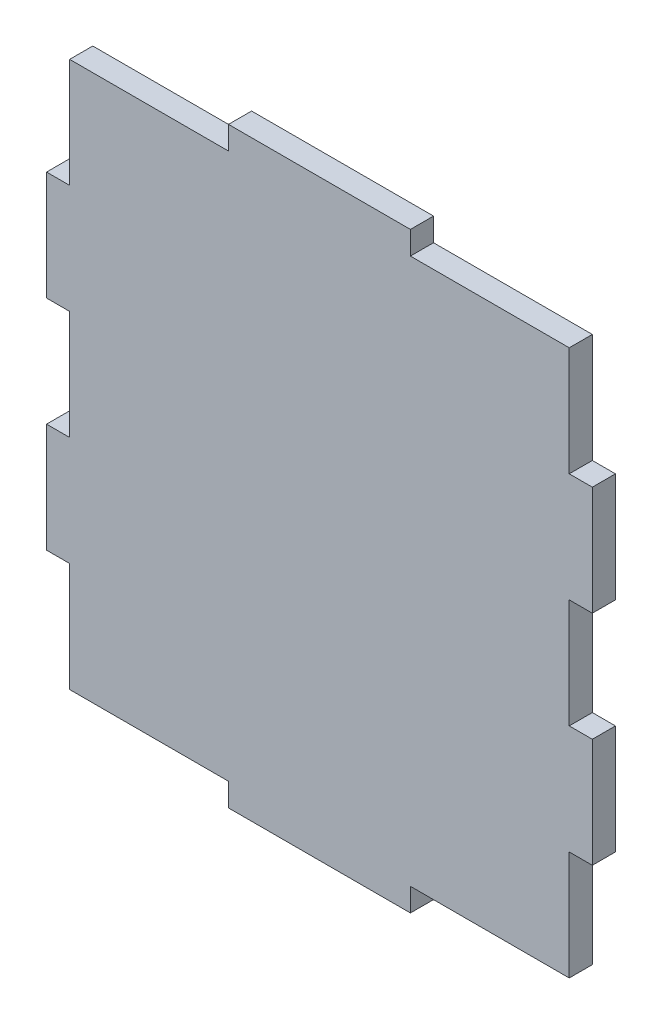
ISO-10303-21;
HEADER;
FILE_DESCRIPTION(('STEP AP214'),'2;1');
FILE_NAME('part.step','',(''),(''),'','','');
FILE_SCHEMA(('AUTOMOTIVE_DESIGN { 1 0 10303 214 1 1 1 1 }'));
ENDSEC;
DATA;
#1=APPLICATION_CONTEXT('core data for automotive mechanical design processes');
#2=APPLICATION_PROTOCOL_DEFINITION('international standard','automotive_design',2000,#1);
#3=PRODUCT_CONTEXT('',#1,'mechanical');
#4=PRODUCT('Part','Part','',(#3));
#5=PRODUCT_RELATED_PRODUCT_CATEGORY('part','',(#4));
#6=PRODUCT_DEFINITION_FORMATION('','',#4);
#7=PRODUCT_DEFINITION_CONTEXT('part definition',#1,'design');
#8=PRODUCT_DEFINITION('design','',#6,#7);
#9=PRODUCT_DEFINITION_SHAPE('','',#8);
#10=(LENGTH_UNIT() NAMED_UNIT(*) SI_UNIT(.MILLI.,.METRE.));
#11=(NAMED_UNIT(*) PLANE_ANGLE_UNIT() SI_UNIT($,.RADIAN.));
#12=(NAMED_UNIT(*) SI_UNIT($,.STERADIAN.) SOLID_ANGLE_UNIT());
#13=UNCERTAINTY_MEASURE_WITH_UNIT(LENGTH_MEASURE(1.E-05),#10,'distance_accuracy_value','');
#14=(GEOMETRIC_REPRESENTATION_CONTEXT(3) GLOBAL_UNCERTAINTY_ASSIGNED_CONTEXT((#13)) GLOBAL_UNIT_ASSIGNED_CONTEXT((#10,
#11,#12)) REPRESENTATION_CONTEXT('',''));
#15=CARTESIAN_POINT('',(0.,0.,0.));
#16=DIRECTION('',(0.,0.,1.));
#17=DIRECTION('',(1.,0.,0.));
#18=AXIS2_PLACEMENT_3D('',#15,#16,#17);
#19=CARTESIAN_POINT('',(-38.3669811320755,56.8820780577358,6.35));
#20=DIRECTION('',(1.,0.,0.));
#21=DIRECTION('',(0.,0.,-1.));
#22=AXIS2_PLACEMENT_3D('',#19,#20,#21);
#23=PLANE('',#22);
#24=DIRECTION('',(0.,-1.,0.));
#25=VECTOR('',#24,1.);
#26=CARTESIAN_POINT('',(-38.3669811320755,56.8820780577358,0.));
#27=LINE('',#26,#25);
#28=CARTESIAN_POINT('',(-38.3669811320755,56.8820780577358,0.));
#29=VERTEX_POINT('',#28);
#30=CARTESIAN_POINT('',(-38.3669811320755,26.8820780577358,0.));
#31=VERTEX_POINT('',#30);
#32=EDGE_CURVE('E249',#29,#31,#27,.T.);
#33=ORIENTED_EDGE('',*,*,#32,.T.);
#34=DIRECTION('',(0.,0.,-1.));
#35=VECTOR('',#34,1.);
#36=CARTESIAN_POINT('',(-38.3669811320755,26.8820780577358,6.35));
#37=LINE('',#36,#35);
#38=CARTESIAN_POINT('',(-38.3669811320755,26.8820780577358,6.35));
#39=VERTEX_POINT('',#38);
#40=EDGE_CURVE('E11',#39,#31,#37,.T.);
#41=ORIENTED_EDGE('',*,*,#40,.F.);
#42=DIRECTION('',(0.,-1.,0.));
#43=VECTOR('',#42,1.);
#44=CARTESIAN_POINT('',(-38.3669811320755,56.8820780577358,6.35));
#45=LINE('',#44,#43);
#46=CARTESIAN_POINT('',(-38.3669811320755,56.8820780577358,6.35));
#47=VERTEX_POINT('',#46);
#48=EDGE_CURVE('E303',#47,#39,#45,.T.);
#49=ORIENTED_EDGE('',*,*,#48,.F.);
#50=DIRECTION('',(0.,0.,-1.));
#51=VECTOR('',#50,1.);
#52=CARTESIAN_POINT('',(-38.3669811320755,56.8820780577358,6.35));
#53=LINE('',#52,#51);
#54=EDGE_CURVE('E245',#47,#29,#53,.T.);
#55=ORIENTED_EDGE('',*,*,#54,.T.);
#56=EDGE_LOOP('',(#33,#41,#49,#55));
#57=FACE_BOUND('',#56,.T.);
#58=ADVANCED_FACE('F33',(#57),#23,.F.);
#59=CARTESIAN_POINT('',(-38.3669811320755,26.8820780577358,6.35));
#60=DIRECTION('',(0.,-1.,0.));
#61=DIRECTION('',(0.,0.,-1.));
#62=AXIS2_PLACEMENT_3D('',#59,#60,#61);
#63=PLANE('',#62);
#64=DIRECTION('',(-1.,0.,0.));
#65=VECTOR('',#64,1.);
#66=CARTESIAN_POINT('',(-38.3669811320755,26.8820780577358,0.));
#67=LINE('',#66,#65);
#68=CARTESIAN_POINT('',(-44.7169811320755,26.8820780577358,0.));
#69=VERTEX_POINT('',#68);
#70=EDGE_CURVE('E252',#31,#69,#67,.T.);
#71=ORIENTED_EDGE('',*,*,#70,.T.);
#72=DIRECTION('',(0.,0.,-1.));
#73=VECTOR('',#72,1.);
#74=CARTESIAN_POINT('',(-44.7169811320755,26.8820780577358,6.35));
#75=LINE('',#74,#73);
#76=CARTESIAN_POINT('',(-44.7169811320755,26.8820780577358,6.35));
#77=VERTEX_POINT('',#76);
#78=EDGE_CURVE('E41',#77,#69,#75,.T.);
#79=ORIENTED_EDGE('',*,*,#78,.F.);
#80=DIRECTION('',(-1.,0.,0.));
#81=VECTOR('',#80,1.);
#82=CARTESIAN_POINT('',(-38.3669811320755,26.8820780577358,6.35));
#83=LINE('',#82,#81);
#84=EDGE_CURVE('E152',#39,#77,#83,.T.);
#85=ORIENTED_EDGE('',*,*,#84,.F.);
#86=ORIENTED_EDGE('',*,*,#40,.T.);
#87=EDGE_LOOP('',(#71,#79,#85,#86));
#88=FACE_BOUND('',#87,.T.);
#89=ADVANCED_FACE('F461',(#88),#63,.F.);
#90=CARTESIAN_POINT('',(-44.7169811320755,26.8820780577358,6.35));
#91=DIRECTION('',(1.,0.,0.));
#92=DIRECTION('',(0.,1.,0.));
#93=AXIS2_PLACEMENT_3D('',#90,#91,#92);
#94=PLANE('',#93);
#95=DIRECTION('',(0.,-1.,0.));
#96=VECTOR('',#95,1.);
#97=CARTESIAN_POINT('',(-44.7169811320755,26.8820780577358,0.));
#98=LINE('',#97,#96);
#99=CARTESIAN_POINT('',(-44.7169811320755,-3.11792194226419,0.));
#100=VERTEX_POINT('',#99);
#101=EDGE_CURVE('E254',#69,#100,#98,.T.);
#102=ORIENTED_EDGE('',*,*,#101,.T.);
#103=DIRECTION('',(0.,0.,-1.));
#104=VECTOR('',#103,1.);
#105=CARTESIAN_POINT('',(-44.7169811320755,-3.11792194226419,6.35));
#106=LINE('',#105,#104);
#107=CARTESIAN_POINT('',(-44.7169811320755,-3.11792194226419,6.35));
#108=VERTEX_POINT('',#107);
#109=EDGE_CURVE('E370',#108,#100,#106,.T.);
#110=ORIENTED_EDGE('',*,*,#109,.F.);
#111=DIRECTION('',(0.,-1.,0.));
#112=VECTOR('',#111,1.);
#113=CARTESIAN_POINT('',(-44.7169811320755,26.8820780577358,6.35));
#114=LINE('',#113,#112);
#115=EDGE_CURVE('E378',#77,#108,#114,.T.);
#116=ORIENTED_EDGE('',*,*,#115,.F.);
#117=ORIENTED_EDGE('',*,*,#78,.T.);
#118=EDGE_LOOP('',(#102,#110,#116,#117));
#119=FACE_BOUND('',#118,.T.);
#120=ADVANCED_FACE('F376',(#119),#94,.F.);
#121=CARTESIAN_POINT('',(-44.7169811320755,-3.11792194226419,6.35));
#122=DIRECTION('',(0.,1.,0.));
#123=DIRECTION('',(0.,0.,1.));
#124=AXIS2_PLACEMENT_3D('',#121,#122,#123);
#125=PLANE('',#124);
#126=DIRECTION('',(1.,0.,0.));
#127=VECTOR('',#126,1.);
#128=CARTESIAN_POINT('',(-44.7169811320755,-3.11792194226419,0.));
#129=LINE('',#128,#127);
#130=CARTESIAN_POINT('',(-38.3669811320755,-3.11792194226419,0.));
#131=VERTEX_POINT('',#130);
#132=EDGE_CURVE('E256',#100,#131,#129,.T.);
#133=ORIENTED_EDGE('',*,*,#132,.T.);
#134=DIRECTION('',(0.,0.,-1.));
#135=VECTOR('',#134,1.);
#136=CARTESIAN_POINT('',(-38.3669811320755,-3.11792194226419,6.35));
#137=LINE('',#136,#135);
#138=CARTESIAN_POINT('',(-38.3669811320755,-3.11792194226419,6.35));
#139=VERTEX_POINT('',#138);
#140=EDGE_CURVE('E367',#139,#131,#137,.T.);
#141=ORIENTED_EDGE('',*,*,#140,.F.);
#142=DIRECTION('',(1.,0.,0.));
#143=VECTOR('',#142,1.);
#144=CARTESIAN_POINT('',(-44.7169811320755,-3.11792194226419,6.35));
#145=LINE('',#144,#143);
#146=EDGE_CURVE('E396',#108,#139,#145,.T.);
#147=ORIENTED_EDGE('',*,*,#146,.F.);
#148=ORIENTED_EDGE('',*,*,#109,.T.);
#149=EDGE_LOOP('',(#133,#141,#147,#148));
#150=FACE_BOUND('',#149,.T.);
#151=ADVANCED_FACE('F387',(#150),#125,.F.);
#152=CARTESIAN_POINT('',(-38.3669811320755,-3.11792194226419,6.35));
#153=DIRECTION('',(1.,0.,0.));
#154=DIRECTION('',(0.,1.,0.));
#155=AXIS2_PLACEMENT_3D('',#152,#153,#154);
#156=PLANE('',#155);
#157=DIRECTION('',(0.,-1.,0.));
#158=VECTOR('',#157,1.);
#159=CARTESIAN_POINT('',(-38.3669811320755,-3.11792194226419,0.));
#160=LINE('',#159,#158);
#161=CARTESIAN_POINT('',(-38.3669811320755,-33.1179219422642,0.));
#162=VERTEX_POINT('',#161);
#163=EDGE_CURVE('E258',#131,#162,#160,.T.);
#164=ORIENTED_EDGE('',*,*,#163,.T.);
#165=DIRECTION('',(0.,0.,-1.));
#166=VECTOR('',#165,1.);
#167=CARTESIAN_POINT('',(-38.3669811320755,-33.1179219422642,6.35));
#168=LINE('',#167,#166);
#169=CARTESIAN_POINT('',(-38.3669811320755,-33.1179219422642,6.35));
#170=VERTEX_POINT('',#169);
#171=EDGE_CURVE('E364',#170,#162,#168,.T.);
#172=ORIENTED_EDGE('',*,*,#171,.F.);
#173=DIRECTION('',(0.,-1.,0.));
#174=VECTOR('',#173,1.);
#175=CARTESIAN_POINT('',(-38.3669811320755,-3.11792194226419,6.35));
#176=LINE('',#175,#174);
#177=EDGE_CURVE('E393',#139,#170,#176,.T.);
#178=ORIENTED_EDGE('',*,*,#177,.F.);
#179=ORIENTED_EDGE('',*,*,#140,.T.);
#180=EDGE_LOOP('',(#164,#172,#178,#179));
#181=FACE_BOUND('',#180,.T.);
#182=ADVANCED_FACE('F391',(#181),#156,.F.);
#183=CARTESIAN_POINT('',(-38.3669811320755,-33.1179219422642,6.35));
#184=DIRECTION('',(0.,-1.,0.));
#185=DIRECTION('',(1.,0.,0.));
#186=AXIS2_PLACEMENT_3D('',#183,#184,#185);
#187=PLANE('',#186);
#188=DIRECTION('',(-1.,0.,0.));
#189=VECTOR('',#188,1.);
#190=CARTESIAN_POINT('',(-38.3669811320755,-33.1179219422642,0.));
#191=LINE('',#190,#189);
#192=CARTESIAN_POINT('',(-44.7169811320755,-33.1179219422642,0.));
#193=VERTEX_POINT('',#192);
#194=EDGE_CURVE('E260',#162,#193,#191,.T.);
#195=ORIENTED_EDGE('',*,*,#194,.T.);
#196=DIRECTION('',(0.,0.,-1.));
#197=VECTOR('',#196,1.);
#198=CARTESIAN_POINT('',(-44.7169811320755,-33.1179219422642,6.35));
#199=LINE('',#198,#197);
#200=CARTESIAN_POINT('',(-44.7169811320755,-33.1179219422642,6.35));
#201=VERTEX_POINT('',#200);
#202=EDGE_CURVE('E361',#201,#193,#199,.T.);
#203=ORIENTED_EDGE('',*,*,#202,.F.);
#204=DIRECTION('',(-1.,0.,0.));
#205=VECTOR('',#204,1.);
#206=CARTESIAN_POINT('',(-38.3669811320755,-33.1179219422642,6.35));
#207=LINE('',#206,#205);
#208=EDGE_CURVE('E395',#170,#201,#207,.T.);
#209=ORIENTED_EDGE('',*,*,#208,.F.);
#210=ORIENTED_EDGE('',*,*,#171,.T.);
#211=EDGE_LOOP('',(#195,#203,#209,#210));
#212=FACE_BOUND('',#211,.T.);
#213=ADVANCED_FACE('F474',(#212),#187,.F.);
#214=CARTESIAN_POINT('',(-44.7169811320755,-33.1179219422642,6.35));
#215=DIRECTION('',(1.,0.,0.));
#216=DIRECTION('',(0.,1.,0.));
#217=AXIS2_PLACEMENT_3D('',#214,#215,#216);
#218=PLANE('',#217);
#219=DIRECTION('',(0.,-1.,0.));
#220=VECTOR('',#219,1.);
#221=CARTESIAN_POINT('',(-44.7169811320755,-33.1179219422642,0.));
#222=LINE('',#221,#220);
#223=CARTESIAN_POINT('',(-44.7169811320754,-63.1179219422642,0.));
#224=VERTEX_POINT('',#223);
#225=EDGE_CURVE('E262',#193,#224,#222,.T.);
#226=ORIENTED_EDGE('',*,*,#225,.T.);
#227=DIRECTION('',(0.,0.,-1.));
#228=VECTOR('',#227,1.);
#229=CARTESIAN_POINT('',(-44.7169811320754,-63.1179219422642,6.35));
#230=LINE('',#229,#228);
#231=CARTESIAN_POINT('',(-44.7169811320754,-63.1179219422642,6.35));
#232=VERTEX_POINT('',#231);
#233=EDGE_CURVE('E358',#232,#224,#230,.T.);
#234=ORIENTED_EDGE('',*,*,#233,.F.);
#235=DIRECTION('',(0.,-1.,0.));
#236=VECTOR('',#235,1.);
#237=CARTESIAN_POINT('',(-44.7169811320755,-33.1179219422642,6.35));
#238=LINE('',#237,#236);
#239=EDGE_CURVE('E398',#201,#232,#238,.T.);
#240=ORIENTED_EDGE('',*,*,#239,.F.);
#241=ORIENTED_EDGE('',*,*,#202,.T.);
#242=EDGE_LOOP('',(#226,#234,#240,#241));
#243=FACE_BOUND('',#242,.T.);
#244=ADVANCED_FACE('F477',(#243),#218,.F.);
#245=CARTESIAN_POINT('',(-44.7169811320754,-63.1179219422642,6.35));
#246=DIRECTION('',(0.,1.,0.));
#247=DIRECTION('',(0.,0.,1.));
#248=AXIS2_PLACEMENT_3D('',#245,#246,#247);
#249=PLANE('',#248);
#250=DIRECTION('',(1.,0.,0.));
#251=VECTOR('',#250,1.);
#252=CARTESIAN_POINT('',(-44.7169811320754,-63.1179219422642,0.));
#253=LINE('',#252,#251);
#254=CARTESIAN_POINT('',(-38.3669811320754,-63.1179219422642,0.));
#255=VERTEX_POINT('',#254);
#256=EDGE_CURVE('E264',#224,#255,#253,.T.);
#257=ORIENTED_EDGE('',*,*,#256,.T.);
#258=DIRECTION('',(0.,0.,-1.));
#259=VECTOR('',#258,1.);
#260=CARTESIAN_POINT('',(-38.3669811320754,-63.1179219422642,6.35));
#261=LINE('',#260,#259);
#262=CARTESIAN_POINT('',(-38.3669811320754,-63.1179219422642,6.35));
#263=VERTEX_POINT('',#262);
#264=EDGE_CURVE('E355',#263,#255,#261,.T.);
#265=ORIENTED_EDGE('',*,*,#264,.F.);
#266=DIRECTION('',(1.,0.,0.));
#267=VECTOR('',#266,1.);
#268=CARTESIAN_POINT('',(-44.7169811320754,-63.1179219422642,6.35));
#269=LINE('',#268,#267);
#270=EDGE_CURVE('E404',#232,#263,#269,.T.);
#271=ORIENTED_EDGE('',*,*,#270,.F.);
#272=ORIENTED_EDGE('',*,*,#233,.T.);
#273=EDGE_LOOP('',(#257,#265,#271,#272));
#274=FACE_BOUND('',#273,.T.);
#275=ADVANCED_FACE('F481',(#274),#249,.F.);
#276=CARTESIAN_POINT('',(-38.3669811320754,-63.1179219422642,6.35));
#277=DIRECTION('',(1.,0.,0.));
#278=DIRECTION('',(0.,0.,-1.));
#279=AXIS2_PLACEMENT_3D('',#276,#277,#278);
#280=PLANE('',#279);
#281=DIRECTION('',(0.,-1.,0.));
#282=VECTOR('',#281,1.);
#283=CARTESIAN_POINT('',(-38.3669811320754,-63.1179219422642,0.));
#284=LINE('',#283,#282);
#285=CARTESIAN_POINT('',(-38.3669811320754,-93.1179219422641,0.));
#286=VERTEX_POINT('',#285);
#287=EDGE_CURVE('E266',#255,#286,#284,.T.);
#288=ORIENTED_EDGE('',*,*,#287,.T.);
#289=DIRECTION('',(0.,0.,-1.));
#290=VECTOR('',#289,1.);
#291=CARTESIAN_POINT('',(-38.3669811320754,-93.1179219422641,6.35));
#292=LINE('',#291,#290);
#293=CARTESIAN_POINT('',(-38.3669811320754,-93.1179219422641,6.35));
#294=VERTEX_POINT('',#293);
#295=EDGE_CURVE('E352',#294,#286,#292,.T.);
#296=ORIENTED_EDGE('',*,*,#295,.F.);
#297=DIRECTION('',(0.,-1.,0.));
#298=VECTOR('',#297,1.);
#299=CARTESIAN_POINT('',(-38.3669811320754,-63.1179219422642,6.35));
#300=LINE('',#299,#298);
#301=EDGE_CURVE('E406',#263,#294,#300,.T.);
#302=ORIENTED_EDGE('',*,*,#301,.F.);
#303=ORIENTED_EDGE('',*,*,#264,.T.);
#304=EDGE_LOOP('',(#288,#296,#302,#303));
#305=FACE_BOUND('',#304,.T.);
#306=ADVANCED_FACE('F485',(#305),#280,.F.);
#307=CARTESIAN_POINT('',(-38.3669811320754,-93.1179219422641,6.35));
#308=DIRECTION('',(0.,1.,0.));
#309=DIRECTION('',(0.,0.,1.));
#310=AXIS2_PLACEMENT_3D('',#307,#308,#309);
#311=PLANE('',#310);
#312=DIRECTION('',(1.,0.,0.));
#313=VECTOR('',#312,1.);
#314=CARTESIAN_POINT('',(-38.3669811320754,-93.1179219422641,0.));
#315=LINE('',#314,#313);
#316=CARTESIAN_POINT('',(5.28301886792427,-93.1179219422641,0.));
#317=VERTEX_POINT('',#316);
#318=EDGE_CURVE('E268',#286,#317,#315,.T.);
#319=ORIENTED_EDGE('',*,*,#318,.T.);
#320=DIRECTION('',(0.,0.,-1.));
#321=VECTOR('',#320,1.);
#322=CARTESIAN_POINT('',(5.28301886792427,-93.1179219422641,6.35));
#323=LINE('',#322,#321);
#324=CARTESIAN_POINT('',(5.28301886792427,-93.1179219422641,6.35));
#325=VERTEX_POINT('',#324);
#326=EDGE_CURVE('E349',#325,#317,#323,.T.);
#327=ORIENTED_EDGE('',*,*,#326,.F.);
#328=DIRECTION('',(1.,0.,0.));
#329=VECTOR('',#328,1.);
#330=CARTESIAN_POINT('',(-38.3669811320754,-93.1179219422641,6.35));
#331=LINE('',#330,#329);
#332=EDGE_CURVE('E408',#294,#325,#331,.T.);
#333=ORIENTED_EDGE('',*,*,#332,.F.);
#334=ORIENTED_EDGE('',*,*,#295,.T.);
#335=EDGE_LOOP('',(#319,#327,#333,#334));
#336=FACE_BOUND('',#335,.T.);
#337=ADVANCED_FACE('F489',(#336),#311,.F.);
#338=CARTESIAN_POINT('',(5.28301886792427,-93.1179219422641,6.35));
#339=DIRECTION('',(1.,0.,0.));
#340=DIRECTION('',(0.,1.,0.));
#341=AXIS2_PLACEMENT_3D('',#338,#339,#340);
#342=PLANE('',#341);
#343=DIRECTION('',(0.,-1.,0.));
#344=VECTOR('',#343,1.);
#345=CARTESIAN_POINT('',(5.28301886792427,-93.1179219422641,0.));
#346=LINE('',#345,#344);
#347=CARTESIAN_POINT('',(5.28301886792427,-99.4679219422641,0.));
#348=VERTEX_POINT('',#347);
#349=EDGE_CURVE('E270',#317,#348,#346,.T.);
#350=ORIENTED_EDGE('',*,*,#349,.T.);
#351=DIRECTION('',(0.,0.,-1.));
#352=VECTOR('',#351,1.);
#353=CARTESIAN_POINT('',(5.28301886792427,-99.4679219422641,6.35));
#354=LINE('',#353,#352);
#355=CARTESIAN_POINT('',(5.28301886792427,-99.4679219422641,6.35));
#356=VERTEX_POINT('',#355);
#357=EDGE_CURVE('E346',#356,#348,#354,.T.);
#358=ORIENTED_EDGE('',*,*,#357,.F.);
#359=DIRECTION('',(0.,-1.,0.));
#360=VECTOR('',#359,1.);
#361=CARTESIAN_POINT('',(5.28301886792427,-93.1179219422641,6.35));
#362=LINE('',#361,#360);
#363=EDGE_CURVE('E410',#325,#356,#362,.T.);
#364=ORIENTED_EDGE('',*,*,#363,.F.);
#365=ORIENTED_EDGE('',*,*,#326,.T.);
#366=EDGE_LOOP('',(#350,#358,#364,#365));
#367=FACE_BOUND('',#366,.T.);
#368=ADVANCED_FACE('F493',(#367),#342,.F.);
#369=CARTESIAN_POINT('',(5.28301886792427,-99.4679219422641,6.35));
#370=DIRECTION('',(0.,1.,0.));
#371=DIRECTION('',(0.,0.,1.));
#372=AXIS2_PLACEMENT_3D('',#369,#370,#371);
#373=PLANE('',#372);
#374=DIRECTION('',(1.,0.,0.));
#375=VECTOR('',#374,1.);
#376=CARTESIAN_POINT('',(5.28301886792427,-99.4679219422641,0.));
#377=LINE('',#376,#375);
#378=CARTESIAN_POINT('',(55.2830188679243,-99.4679219422641,0.));
#379=VERTEX_POINT('',#378);
#380=EDGE_CURVE('E272',#348,#379,#377,.T.);
#381=ORIENTED_EDGE('',*,*,#380,.T.);
#382=DIRECTION('',(0.,0.,-1.));
#383=VECTOR('',#382,1.);
#384=CARTESIAN_POINT('',(55.2830188679243,-99.4679219422641,6.35));
#385=LINE('',#384,#383);
#386=CARTESIAN_POINT('',(55.2830188679243,-99.4679219422641,6.35));
#387=VERTEX_POINT('',#386);
#388=EDGE_CURVE('E343',#387,#379,#385,.T.);
#389=ORIENTED_EDGE('',*,*,#388,.F.);
#390=DIRECTION('',(1.,0.,0.));
#391=VECTOR('',#390,1.);
#392=CARTESIAN_POINT('',(5.28301886792427,-99.4679219422641,6.35));
#393=LINE('',#392,#391);
#394=EDGE_CURVE('E412',#356,#387,#393,.T.);
#395=ORIENTED_EDGE('',*,*,#394,.F.);
#396=ORIENTED_EDGE('',*,*,#357,.T.);
#397=EDGE_LOOP('',(#381,#389,#395,#396));
#398=FACE_BOUND('',#397,.T.);
#399=ADVANCED_FACE('F497',(#398),#373,.F.);
#400=CARTESIAN_POINT('',(55.2830188679243,-99.4679219422641,6.35));
#401=DIRECTION('',(-1.,0.,0.));
#402=DIRECTION('',(0.,0.,1.));
#403=AXIS2_PLACEMENT_3D('',#400,#401,#402);
#404=PLANE('',#403);
#405=DIRECTION('',(0.,1.,0.));
#406=VECTOR('',#405,1.);
#407=CARTESIAN_POINT('',(55.2830188679243,-99.4679219422641,0.));
#408=LINE('',#407,#406);
#409=CARTESIAN_POINT('',(55.2830188679243,-93.1179219422641,0.));
#410=VERTEX_POINT('',#409);
#411=EDGE_CURVE('E274',#379,#410,#408,.T.);
#412=ORIENTED_EDGE('',*,*,#411,.T.);
#413=DIRECTION('',(0.,0.,-1.));
#414=VECTOR('',#413,1.);
#415=CARTESIAN_POINT('',(55.2830188679243,-93.1179219422641,6.35));
#416=LINE('',#415,#414);
#417=CARTESIAN_POINT('',(55.2830188679243,-93.1179219422641,6.35));
#418=VERTEX_POINT('',#417);
#419=EDGE_CURVE('E340',#418,#410,#416,.T.);
#420=ORIENTED_EDGE('',*,*,#419,.F.);
#421=DIRECTION('',(0.,1.,0.));
#422=VECTOR('',#421,1.);
#423=CARTESIAN_POINT('',(55.2830188679243,-99.4679219422641,6.35));
#424=LINE('',#423,#422);
#425=EDGE_CURVE('E414',#387,#418,#424,.T.);
#426=ORIENTED_EDGE('',*,*,#425,.F.);
#427=ORIENTED_EDGE('',*,*,#388,.T.);
#428=EDGE_LOOP('',(#412,#420,#426,#427));
#429=FACE_BOUND('',#428,.T.);
#430=ADVANCED_FACE('F501',(#429),#404,.F.);
#431=CARTESIAN_POINT('',(55.2830188679243,-93.1179219422641,6.35));
#432=DIRECTION('',(0.,1.,0.));
#433=DIRECTION('',(0.,0.,1.));
#434=AXIS2_PLACEMENT_3D('',#431,#432,#433);
#435=PLANE('',#434);
#436=DIRECTION('',(1.,0.,0.));
#437=VECTOR('',#436,1.);
#438=CARTESIAN_POINT('',(55.2830188679243,-93.1179219422641,0.));
#439=LINE('',#438,#437);
#440=CARTESIAN_POINT('',(98.9330188679245,-93.1179219422641,0.));
#441=VERTEX_POINT('',#440);
#442=EDGE_CURVE('E276',#410,#441,#439,.T.);
#443=ORIENTED_EDGE('',*,*,#442,.T.);
#444=DIRECTION('',(0.,0.,-1.));
#445=VECTOR('',#444,1.);
#446=CARTESIAN_POINT('',(98.9330188679245,-93.1179219422641,6.35));
#447=LINE('',#446,#445);
#448=CARTESIAN_POINT('',(98.9330188679245,-93.1179219422641,6.35));
#449=VERTEX_POINT('',#448);
#450=EDGE_CURVE('E337',#449,#441,#447,.T.);
#451=ORIENTED_EDGE('',*,*,#450,.F.);
#452=DIRECTION('',(1.,0.,0.));
#453=VECTOR('',#452,1.);
#454=CARTESIAN_POINT('',(55.2830188679243,-93.1179219422641,6.35));
#455=LINE('',#454,#453);
#456=EDGE_CURVE('E416',#418,#449,#455,.T.);
#457=ORIENTED_EDGE('',*,*,#456,.F.);
#458=ORIENTED_EDGE('',*,*,#419,.T.);
#459=EDGE_LOOP('',(#443,#451,#457,#458));
#460=FACE_BOUND('',#459,.T.);
#461=ADVANCED_FACE('F505',(#460),#435,.F.);
#462=CARTESIAN_POINT('',(98.9330188679245,-63.1179219422642,6.35));
#463=DIRECTION('',(-1.,0.,0.));
#464=DIRECTION('',(0.,-1.,0.));
#465=AXIS2_PLACEMENT_3D('',#462,#463,#464);
#466=PLANE('',#465);
#467=DIRECTION('',(0.,1.,0.));
#468=VECTOR('',#467,1.);
#469=CARTESIAN_POINT('',(98.9330188679245,-63.1179219422642,0.));
#470=LINE('',#469,#468);
#471=CARTESIAN_POINT('',(98.9330188679245,-63.1179219422642,0.));
#472=VERTEX_POINT('',#471);
#473=EDGE_CURVE('E278',#441,#472,#470,.T.);
#474=ORIENTED_EDGE('',*,*,#473,.T.);
#475=DIRECTION('',(0.,0.,-1.));
#476=VECTOR('',#475,1.);
#477=CARTESIAN_POINT('',(98.9330188679245,-63.1179219422642,6.35));
#478=LINE('',#477,#476);
#479=CARTESIAN_POINT('',(98.9330188679245,-63.1179219422642,6.35));
#480=VERTEX_POINT('',#479);
#481=EDGE_CURVE('E334',#480,#472,#478,.T.);
#482=ORIENTED_EDGE('',*,*,#481,.F.);
#483=DIRECTION('',(0.,1.,0.));
#484=VECTOR('',#483,1.);
#485=CARTESIAN_POINT('',(98.9330188679245,-63.1179219422642,6.35));
#486=LINE('',#485,#484);
#487=EDGE_CURVE('E418',#449,#480,#486,.T.);
#488=ORIENTED_EDGE('',*,*,#487,.F.);
#489=ORIENTED_EDGE('',*,*,#450,.T.);
#490=EDGE_LOOP('',(#474,#482,#488,#489));
#491=FACE_BOUND('',#490,.T.);
#492=ADVANCED_FACE('F509',(#491),#466,.F.);
#493=CARTESIAN_POINT('',(105.283018867924,-63.1179219422642,6.35));
#494=DIRECTION('',(0.,1.,0.));
#495=DIRECTION('',(0.,0.,1.));
#496=AXIS2_PLACEMENT_3D('',#493,#494,#495);
#497=PLANE('',#496);
#498=DIRECTION('',(1.,0.,0.));
#499=VECTOR('',#498,1.);
#500=CARTESIAN_POINT('',(105.283018867924,-63.1179219422642,0.));
#501=LINE('',#500,#499);
#502=CARTESIAN_POINT('',(105.283018867924,-63.1179219422642,0.));
#503=VERTEX_POINT('',#502);
#504=EDGE_CURVE('E280',#472,#503,#501,.T.);
#505=ORIENTED_EDGE('',*,*,#504,.T.);
#506=DIRECTION('',(0.,0.,-1.));
#507=VECTOR('',#506,1.);
#508=CARTESIAN_POINT('',(105.283018867924,-63.1179219422642,6.35));
#509=LINE('',#508,#507);
#510=CARTESIAN_POINT('',(105.283018867924,-63.1179219422642,6.35));
#511=VERTEX_POINT('',#510);
#512=EDGE_CURVE('E331',#511,#503,#509,.T.);
#513=ORIENTED_EDGE('',*,*,#512,.F.);
#514=DIRECTION('',(1.,0.,0.));
#515=VECTOR('',#514,1.);
#516=CARTESIAN_POINT('',(105.283018867924,-63.1179219422642,6.35));
#517=LINE('',#516,#515);
#518=EDGE_CURVE('E420',#480,#511,#517,.T.);
#519=ORIENTED_EDGE('',*,*,#518,.F.);
#520=ORIENTED_EDGE('',*,*,#481,.T.);
#521=EDGE_LOOP('',(#505,#513,#519,#520));
#522=FACE_BOUND('',#521,.T.);
#523=ADVANCED_FACE('F513',(#522),#497,.F.);
#524=CARTESIAN_POINT('',(105.283018867924,-33.1179219422638,6.35));
#525=DIRECTION('',(-1.,0.,0.));
#526=DIRECTION('',(0.,0.,1.));
#527=AXIS2_PLACEMENT_3D('',#524,#525,#526);
#528=PLANE('',#527);
#529=DIRECTION('',(0.,1.,0.));
#530=VECTOR('',#529,1.);
#531=CARTESIAN_POINT('',(105.283018867924,-33.1179219422638,0.));
#532=LINE('',#531,#530);
#533=CARTESIAN_POINT('',(105.283018867924,-33.1179219422638,0.));
#534=VERTEX_POINT('',#533);
#535=EDGE_CURVE('E282',#503,#534,#532,.T.);
#536=ORIENTED_EDGE('',*,*,#535,.T.);
#537=DIRECTION('',(0.,0.,-1.));
#538=VECTOR('',#537,1.);
#539=CARTESIAN_POINT('',(105.283018867924,-33.1179219422638,6.35));
#540=LINE('',#539,#538);
#541=CARTESIAN_POINT('',(105.283018867924,-33.1179219422638,6.35));
#542=VERTEX_POINT('',#541);
#543=EDGE_CURVE('E328',#542,#534,#540,.T.);
#544=ORIENTED_EDGE('',*,*,#543,.F.);
#545=DIRECTION('',(0.,1.,0.));
#546=VECTOR('',#545,1.);
#547=CARTESIAN_POINT('',(105.283018867924,-33.1179219422638,6.35));
#548=LINE('',#547,#546);
#549=EDGE_CURVE('E422',#511,#542,#548,.T.);
#550=ORIENTED_EDGE('',*,*,#549,.F.);
#551=ORIENTED_EDGE('',*,*,#512,.T.);
#552=EDGE_LOOP('',(#536,#544,#550,#551));
#553=FACE_BOUND('',#552,.T.);
#554=ADVANCED_FACE('F517',(#553),#528,.F.);
#555=CARTESIAN_POINT('',(98.9330188679245,-33.1179219422638,6.35));
#556=DIRECTION('',(0.,-1.,0.));
#557=DIRECTION('',(1.,0.,0.));
#558=AXIS2_PLACEMENT_3D('',#555,#556,#557);
#559=PLANE('',#558);
#560=DIRECTION('',(-1.,0.,0.));
#561=VECTOR('',#560,1.);
#562=CARTESIAN_POINT('',(98.9330188679245,-33.1179219422638,0.));
#563=LINE('',#562,#561);
#564=CARTESIAN_POINT('',(98.9330188679245,-33.1179219422638,0.));
#565=VERTEX_POINT('',#564);
#566=EDGE_CURVE('E284',#534,#565,#563,.T.);
#567=ORIENTED_EDGE('',*,*,#566,.T.);
#568=DIRECTION('',(0.,0.,-1.));
#569=VECTOR('',#568,1.);
#570=CARTESIAN_POINT('',(98.9330188679245,-33.1179219422638,6.35));
#571=LINE('',#570,#569);
#572=CARTESIAN_POINT('',(98.9330188679245,-33.1179219422638,6.35));
#573=VERTEX_POINT('',#572);
#574=EDGE_CURVE('E325',#573,#565,#571,.T.);
#575=ORIENTED_EDGE('',*,*,#574,.F.);
#576=DIRECTION('',(-1.,0.,0.));
#577=VECTOR('',#576,1.);
#578=CARTESIAN_POINT('',(98.9330188679245,-33.1179219422638,6.35));
#579=LINE('',#578,#577);
#580=EDGE_CURVE('E424',#542,#573,#579,.T.);
#581=ORIENTED_EDGE('',*,*,#580,.F.);
#582=ORIENTED_EDGE('',*,*,#543,.T.);
#583=EDGE_LOOP('',(#567,#575,#581,#582));
#584=FACE_BOUND('',#583,.T.);
#585=ADVANCED_FACE('F521',(#584),#559,.F.);
#586=CARTESIAN_POINT('',(98.9330188679245,-3.11792194226376,6.35));
#587=DIRECTION('',(-1.,0.,0.));
#588=DIRECTION('',(0.,-1.,0.));
#589=AXIS2_PLACEMENT_3D('',#586,#587,#588);
#590=PLANE('',#589);
#591=DIRECTION('',(0.,1.,0.));
#592=VECTOR('',#591,1.);
#593=CARTESIAN_POINT('',(98.9330188679245,-3.11792194226376,0.));
#594=LINE('',#593,#592);
#595=CARTESIAN_POINT('',(98.9330188679245,-3.11792194226376,0.));
#596=VERTEX_POINT('',#595);
#597=EDGE_CURVE('E286',#565,#596,#594,.T.);
#598=ORIENTED_EDGE('',*,*,#597,.T.);
#599=DIRECTION('',(0.,0.,-1.));
#600=VECTOR('',#599,1.);
#601=CARTESIAN_POINT('',(98.9330188679245,-3.11792194226376,6.35));
#602=LINE('',#601,#600);
#603=CARTESIAN_POINT('',(98.9330188679245,-3.11792194226376,6.35));
#604=VERTEX_POINT('',#603);
#605=EDGE_CURVE('E322',#604,#596,#602,.T.);
#606=ORIENTED_EDGE('',*,*,#605,.F.);
#607=DIRECTION('',(0.,1.,0.));
#608=VECTOR('',#607,1.);
#609=CARTESIAN_POINT('',(98.9330188679245,-3.11792194226376,6.35));
#610=LINE('',#609,#608);
#611=EDGE_CURVE('E426',#573,#604,#610,.T.);
#612=ORIENTED_EDGE('',*,*,#611,.F.);
#613=ORIENTED_EDGE('',*,*,#574,.T.);
#614=EDGE_LOOP('',(#598,#606,#612,#613));
#615=FACE_BOUND('',#614,.T.);
#616=ADVANCED_FACE('F525',(#615),#590,.F.);
#617=CARTESIAN_POINT('',(105.283018867924,-3.11792194226376,6.35));
#618=DIRECTION('',(0.,1.,0.));
#619=DIRECTION('',(-1.,0.,0.));
#620=AXIS2_PLACEMENT_3D('',#617,#618,#619);
#621=PLANE('',#620);
#622=DIRECTION('',(1.,0.,0.));
#623=VECTOR('',#622,1.);
#624=CARTESIAN_POINT('',(105.283018867924,-3.11792194226376,0.));
#625=LINE('',#624,#623);
#626=CARTESIAN_POINT('',(105.283018867924,-3.11792194226376,0.));
#627=VERTEX_POINT('',#626);
#628=EDGE_CURVE('E288',#596,#627,#625,.T.);
#629=ORIENTED_EDGE('',*,*,#628,.T.);
#630=DIRECTION('',(0.,0.,-1.));
#631=VECTOR('',#630,1.);
#632=CARTESIAN_POINT('',(105.283018867924,-3.11792194226376,6.35));
#633=LINE('',#632,#631);
#634=CARTESIAN_POINT('',(105.283018867924,-3.11792194226376,6.35));
#635=VERTEX_POINT('',#634);
#636=EDGE_CURVE('E319',#635,#627,#633,.T.);
#637=ORIENTED_EDGE('',*,*,#636,.F.);
#638=DIRECTION('',(1.,0.,0.));
#639=VECTOR('',#638,1.);
#640=CARTESIAN_POINT('',(105.283018867924,-3.11792194226376,6.35));
#641=LINE('',#640,#639);
#642=EDGE_CURVE('E428',#604,#635,#641,.T.);
#643=ORIENTED_EDGE('',*,*,#642,.F.);
#644=ORIENTED_EDGE('',*,*,#605,.T.);
#645=EDGE_LOOP('',(#629,#637,#643,#644));
#646=FACE_BOUND('',#645,.T.);
#647=ADVANCED_FACE('F529',(#646),#621,.F.);
#648=CARTESIAN_POINT('',(105.283018867924,26.8820780577362,6.35));
#649=DIRECTION('',(-1.,0.,0.));
#650=DIRECTION('',(0.,0.,1.));
#651=AXIS2_PLACEMENT_3D('',#648,#649,#650);
#652=PLANE('',#651);
#653=DIRECTION('',(0.,1.,0.));
#654=VECTOR('',#653,1.);
#655=CARTESIAN_POINT('',(105.283018867924,26.8820780577362,0.));
#656=LINE('',#655,#654);
#657=CARTESIAN_POINT('',(105.283018867924,26.8820780577362,0.));
#658=VERTEX_POINT('',#657);
#659=EDGE_CURVE('E290',#627,#658,#656,.T.);
#660=ORIENTED_EDGE('',*,*,#659,.T.);
#661=DIRECTION('',(0.,0.,-1.));
#662=VECTOR('',#661,1.);
#663=CARTESIAN_POINT('',(105.283018867924,26.8820780577362,6.35));
#664=LINE('',#663,#662);
#665=CARTESIAN_POINT('',(105.283018867924,26.8820780577362,6.35));
#666=VERTEX_POINT('',#665);
#667=EDGE_CURVE('E316',#666,#658,#664,.T.);
#668=ORIENTED_EDGE('',*,*,#667,.F.);
#669=DIRECTION('',(0.,1.,0.));
#670=VECTOR('',#669,1.);
#671=CARTESIAN_POINT('',(105.283018867924,26.8820780577362,6.35));
#672=LINE('',#671,#670);
#673=EDGE_CURVE('E430',#635,#666,#672,.T.);
#674=ORIENTED_EDGE('',*,*,#673,.F.);
#675=ORIENTED_EDGE('',*,*,#636,.T.);
#676=EDGE_LOOP('',(#660,#668,#674,#675));
#677=FACE_BOUND('',#676,.T.);
#678=ADVANCED_FACE('F533',(#677),#652,.F.);
#679=CARTESIAN_POINT('',(98.9330188679245,26.8820780577362,6.35));
#680=DIRECTION('',(0.,-1.,0.));
#681=DIRECTION('',(1.,0.,0.));
#682=AXIS2_PLACEMENT_3D('',#679,#680,#681);
#683=PLANE('',#682);
#684=DIRECTION('',(-1.,0.,0.));
#685=VECTOR('',#684,1.);
#686=CARTESIAN_POINT('',(98.9330188679245,26.8820780577362,0.));
#687=LINE('',#686,#685);
#688=CARTESIAN_POINT('',(98.9330188679245,26.8820780577362,0.));
#689=VERTEX_POINT('',#688);
#690=EDGE_CURVE('E292',#658,#689,#687,.T.);
#691=ORIENTED_EDGE('',*,*,#690,.T.);
#692=DIRECTION('',(0.,0.,-1.));
#693=VECTOR('',#692,1.);
#694=CARTESIAN_POINT('',(98.9330188679245,26.8820780577362,6.35));
#695=LINE('',#694,#693);
#696=CARTESIAN_POINT('',(98.9330188679245,26.8820780577362,6.35));
#697=VERTEX_POINT('',#696);
#698=EDGE_CURVE('E313',#697,#689,#695,.T.);
#699=ORIENTED_EDGE('',*,*,#698,.F.);
#700=DIRECTION('',(-1.,0.,0.));
#701=VECTOR('',#700,1.);
#702=CARTESIAN_POINT('',(98.9330188679245,26.8820780577362,6.35));
#703=LINE('',#702,#701);
#704=EDGE_CURVE('E432',#666,#697,#703,.T.);
#705=ORIENTED_EDGE('',*,*,#704,.F.);
#706=ORIENTED_EDGE('',*,*,#667,.T.);
#707=EDGE_LOOP('',(#691,#699,#705,#706));
#708=FACE_BOUND('',#707,.T.);
#709=ADVANCED_FACE('F537',(#708),#683,.F.);
#710=CARTESIAN_POINT('',(98.9330188679245,56.8820780577358,6.35));
#711=DIRECTION('',(-1.,0.,0.));
#712=DIRECTION('',(0.,0.,1.));
#713=AXIS2_PLACEMENT_3D('',#710,#711,#712);
#714=PLANE('',#713);
#715=DIRECTION('',(0.,1.,0.));
#716=VECTOR('',#715,1.);
#717=CARTESIAN_POINT('',(98.9330188679245,56.8820780577358,0.));
#718=LINE('',#717,#716);
#719=CARTESIAN_POINT('',(98.9330188679245,56.8820780577358,0.));
#720=VERTEX_POINT('',#719);
#721=EDGE_CURVE('E294',#689,#720,#718,.T.);
#722=ORIENTED_EDGE('',*,*,#721,.T.);
#723=DIRECTION('',(0.,0.,-1.));
#724=VECTOR('',#723,1.);
#725=CARTESIAN_POINT('',(98.9330188679245,56.8820780577358,6.35));
#726=LINE('',#725,#724);
#727=CARTESIAN_POINT('',(98.9330188679245,56.8820780577358,6.35));
#728=VERTEX_POINT('',#727);
#729=EDGE_CURVE('E310',#728,#720,#726,.T.);
#730=ORIENTED_EDGE('',*,*,#729,.F.);
#731=DIRECTION('',(0.,1.,0.));
#732=VECTOR('',#731,1.);
#733=CARTESIAN_POINT('',(98.9330188679245,56.8820780577358,6.35));
#734=LINE('',#733,#732);
#735=EDGE_CURVE('E434',#697,#728,#734,.T.);
#736=ORIENTED_EDGE('',*,*,#735,.F.);
#737=ORIENTED_EDGE('',*,*,#698,.T.);
#738=EDGE_LOOP('',(#722,#730,#736,#737));
#739=FACE_BOUND('',#738,.T.);
#740=ADVANCED_FACE('F541',(#739),#714,.F.);
#741=CARTESIAN_POINT('',(55.2830188679242,56.8820780577358,6.35));
#742=DIRECTION('',(0.,-1.,0.));
#743=DIRECTION('',(1.,0.,0.));
#744=AXIS2_PLACEMENT_3D('',#741,#742,#743);
#745=PLANE('',#744);
#746=DIRECTION('',(-1.,0.,0.));
#747=VECTOR('',#746,1.);
#748=CARTESIAN_POINT('',(55.2830188679242,56.8820780577358,0.));
#749=LINE('',#748,#747);
#750=CARTESIAN_POINT('',(55.2830188679242,56.8820780577358,0.));
#751=VERTEX_POINT('',#750);
#752=EDGE_CURVE('E296',#720,#751,#749,.T.);
#753=ORIENTED_EDGE('',*,*,#752,.T.);
#754=DIRECTION('',(0.,0.,-1.));
#755=VECTOR('',#754,1.);
#756=CARTESIAN_POINT('',(55.2830188679242,56.8820780577358,6.35));
#757=LINE('',#756,#755);
#758=CARTESIAN_POINT('',(55.2830188679242,56.8820780577358,6.35));
#759=VERTEX_POINT('',#758);
#760=EDGE_CURVE('E307',#759,#751,#757,.T.);
#761=ORIENTED_EDGE('',*,*,#760,.F.);
#762=DIRECTION('',(-1.,0.,0.));
#763=VECTOR('',#762,1.);
#764=CARTESIAN_POINT('',(55.2830188679242,56.8820780577358,6.35));
#765=LINE('',#764,#763);
#766=EDGE_CURVE('E436',#728,#759,#765,.T.);
#767=ORIENTED_EDGE('',*,*,#766,.F.);
#768=ORIENTED_EDGE('',*,*,#729,.T.);
#769=EDGE_LOOP('',(#753,#761,#767,#768));
#770=FACE_BOUND('',#769,.T.);
#771=ADVANCED_FACE('F442',(#770),#745,.F.);
#772=CARTESIAN_POINT('',(55.2830188679242,63.2320780577358,6.35));
#773=DIRECTION('',(-1.,0.,0.));
#774=DIRECTION('',(0.,0.,1.));
#775=AXIS2_PLACEMENT_3D('',#772,#773,#774);
#776=PLANE('',#775);
#777=DIRECTION('',(0.,1.,0.));
#778=VECTOR('',#777,1.);
#779=CARTESIAN_POINT('',(55.2830188679242,63.2320780577358,0.));
#780=LINE('',#779,#778);
#781=CARTESIAN_POINT('',(55.2830188679242,63.2320780577358,0.));
#782=VERTEX_POINT('',#781);
#783=EDGE_CURVE('E298',#751,#782,#780,.T.);
#784=ORIENTED_EDGE('',*,*,#783,.T.);
#785=DIRECTION('',(0.,0.,-1.));
#786=VECTOR('',#785,1.);
#787=CARTESIAN_POINT('',(55.2830188679242,63.2320780577358,6.35));
#788=LINE('',#787,#786);
#789=CARTESIAN_POINT('',(55.2830188679242,63.2320780577358,6.35));
#790=VERTEX_POINT('',#789);
#791=EDGE_CURVE('E240',#790,#782,#788,.T.);
#792=ORIENTED_EDGE('',*,*,#791,.F.);
#793=DIRECTION('',(0.,1.,0.));
#794=VECTOR('',#793,1.);
#795=CARTESIAN_POINT('',(55.2830188679242,63.2320780577358,6.35));
#796=LINE('',#795,#794);
#797=EDGE_CURVE('E231',#759,#790,#796,.T.);
#798=ORIENTED_EDGE('',*,*,#797,.F.);
#799=ORIENTED_EDGE('',*,*,#760,.T.);
#800=EDGE_LOOP('',(#784,#792,#798,#799));
#801=FACE_BOUND('',#800,.T.);
#802=ADVANCED_FACE('F446',(#801),#776,.F.);
#803=CARTESIAN_POINT('',(5.28301886792425,63.2320780577358,6.35));
#804=DIRECTION('',(0.,-1.,0.));
#805=DIRECTION('',(0.,0.,-1.));
#806=AXIS2_PLACEMENT_3D('',#803,#804,#805);
#807=PLANE('',#806);
#808=DIRECTION('',(-1.,0.,0.));
#809=VECTOR('',#808,1.);
#810=CARTESIAN_POINT('',(5.28301886792425,63.2320780577358,0.));
#811=LINE('',#810,#809);
#812=CARTESIAN_POINT('',(5.28301886792425,63.2320780577358,0.));
#813=VERTEX_POINT('',#812);
#814=EDGE_CURVE('E239',#782,#813,#811,.T.);
#815=ORIENTED_EDGE('',*,*,#814,.T.);
#816=DIRECTION('',(0.,0.,-1.));
#817=VECTOR('',#816,1.);
#818=CARTESIAN_POINT('',(5.28301886792425,63.2320780577358,6.35));
#819=LINE('',#818,#817);
#820=CARTESIAN_POINT('',(5.28301886792425,63.2320780577358,6.35));
#821=VERTEX_POINT('',#820);
#822=EDGE_CURVE('E236',#821,#813,#819,.T.);
#823=ORIENTED_EDGE('',*,*,#822,.F.);
#824=DIRECTION('',(-1.,0.,0.));
#825=VECTOR('',#824,1.);
#826=CARTESIAN_POINT('',(5.28301886792425,63.2320780577358,6.35));
#827=LINE('',#826,#825);
#828=EDGE_CURVE('E225',#790,#821,#827,.T.);
#829=ORIENTED_EDGE('',*,*,#828,.F.);
#830=ORIENTED_EDGE('',*,*,#791,.T.);
#831=EDGE_LOOP('',(#815,#823,#829,#830));
#832=FACE_BOUND('',#831,.T.);
#833=ADVANCED_FACE('F237',(#832),#807,.F.);
#834=CARTESIAN_POINT('',(5.28301886792425,56.8820780577358,6.35));
#835=DIRECTION('',(1.,0.,0.));
#836=DIRECTION('',(0.,0.,-1.));
#837=AXIS2_PLACEMENT_3D('',#834,#835,#836);
#838=PLANE('',#837);
#839=DIRECTION('',(0.,-1.,0.));
#840=VECTOR('',#839,1.);
#841=CARTESIAN_POINT('',(5.28301886792425,56.8820780577358,0.));
#842=LINE('',#841,#840);
#843=CARTESIAN_POINT('',(5.28301886792425,56.8820780577358,0.));
#844=VERTEX_POINT('',#843);
#845=EDGE_CURVE('E138',#813,#844,#842,.T.);
#846=ORIENTED_EDGE('',*,*,#845,.T.);
#847=DIRECTION('',(0.,0.,-1.));
#848=VECTOR('',#847,1.);
#849=CARTESIAN_POINT('',(5.28301886792425,56.8820780577358,6.35));
#850=LINE('',#849,#848);
#851=CARTESIAN_POINT('',(5.28301886792425,56.8820780577358,6.35));
#852=VERTEX_POINT('',#851);
#853=EDGE_CURVE('E241',#852,#844,#850,.T.);
#854=ORIENTED_EDGE('',*,*,#853,.F.);
#855=DIRECTION('',(0.,-1.,0.));
#856=VECTOR('',#855,1.);
#857=CARTESIAN_POINT('',(5.28301886792425,56.8820780577358,6.35));
#858=LINE('',#857,#856);
#859=EDGE_CURVE('E229',#821,#852,#858,.T.);
#860=ORIENTED_EDGE('',*,*,#859,.F.);
#861=ORIENTED_EDGE('',*,*,#822,.T.);
#862=EDGE_LOOP('',(#846,#854,#860,#861));
#863=FACE_BOUND('',#862,.T.);
#864=ADVANCED_FACE('F243',(#863),#838,.F.);
#865=CARTESIAN_POINT('',(-38.3669811320755,56.8820780577358,6.35));
#866=DIRECTION('',(0.,-1.,0.));
#867=DIRECTION('',(1.,0.,0.));
#868=AXIS2_PLACEMENT_3D('',#865,#866,#867);
#869=PLANE('',#868);
#870=DIRECTION('',(-1.,0.,0.));
#871=VECTOR('',#870,1.);
#872=CARTESIAN_POINT('',(-38.3669811320755,56.8820780577358,0.));
#873=LINE('',#872,#871);
#874=EDGE_CURVE('E144',#844,#29,#873,.T.);
#875=ORIENTED_EDGE('',*,*,#874,.T.);
#876=ORIENTED_EDGE('',*,*,#54,.F.);
#877=DIRECTION('',(-1.,0.,0.));
#878=VECTOR('',#877,1.);
#879=CARTESIAN_POINT('',(-38.3669811320755,56.8820780577358,6.35));
#880=LINE('',#879,#878);
#881=EDGE_CURVE('E49',#852,#47,#880,.T.);
#882=ORIENTED_EDGE('',*,*,#881,.F.);
#883=ORIENTED_EDGE('',*,*,#853,.T.);
#884=EDGE_LOOP('',(#875,#876,#882,#883));
#885=FACE_BOUND('',#884,.T.);
#886=ADVANCED_FACE('F450',(#885),#869,.F.);
#887=CARTESIAN_POINT('',(0.,0.,6.35));
#888=DIRECTION('',(0.,0.,-1.));
#889=DIRECTION('',(-1.,0.,0.));
#890=AXIS2_PLACEMENT_3D('',#887,#888,#889);
#891=PLANE('',#890);
#892=ORIENTED_EDGE('',*,*,#48,.T.);
#893=ORIENTED_EDGE('',*,*,#84,.T.);
#894=ORIENTED_EDGE('',*,*,#115,.T.);
#895=ORIENTED_EDGE('',*,*,#146,.T.);
#896=ORIENTED_EDGE('',*,*,#177,.T.);
#897=ORIENTED_EDGE('',*,*,#208,.T.);
#898=ORIENTED_EDGE('',*,*,#239,.T.);
#899=ORIENTED_EDGE('',*,*,#270,.T.);
#900=ORIENTED_EDGE('',*,*,#301,.T.);
#901=ORIENTED_EDGE('',*,*,#332,.T.);
#902=ORIENTED_EDGE('',*,*,#363,.T.);
#903=ORIENTED_EDGE('',*,*,#394,.T.);
#904=ORIENTED_EDGE('',*,*,#425,.T.);
#905=ORIENTED_EDGE('',*,*,#456,.T.);
#906=ORIENTED_EDGE('',*,*,#487,.T.);
#907=ORIENTED_EDGE('',*,*,#518,.T.);
#908=ORIENTED_EDGE('',*,*,#549,.T.);
#909=ORIENTED_EDGE('',*,*,#580,.T.);
#910=ORIENTED_EDGE('',*,*,#611,.T.);
#911=ORIENTED_EDGE('',*,*,#642,.T.);
#912=ORIENTED_EDGE('',*,*,#673,.T.);
#913=ORIENTED_EDGE('',*,*,#704,.T.);
#914=ORIENTED_EDGE('',*,*,#735,.T.);
#915=ORIENTED_EDGE('',*,*,#766,.T.);
#916=ORIENTED_EDGE('',*,*,#797,.T.);
#917=ORIENTED_EDGE('',*,*,#828,.T.);
#918=ORIENTED_EDGE('',*,*,#859,.T.);
#919=ORIENTED_EDGE('',*,*,#881,.T.);
#920=EDGE_LOOP('',(#892,#893,#894,#895,#896,#897,#898,#899,#900,#901,#902,#903,#904,#905,#906,
#907,#908,#909,#910,#911,#912,#913,#914,#915,#916,#917,#918,#919));
#921=FACE_BOUND('',#920,.T.);
#922=ADVANCED_FACE('F227',(#921),#891,.F.);
#923=CARTESIAN_POINT('',(0.,0.,0.));
#924=DIRECTION('',(0.,0.,-1.));
#925=DIRECTION('',(-1.,0.,0.));
#926=AXIS2_PLACEMENT_3D('',#923,#924,#925);
#927=PLANE('',#926);
#928=ORIENTED_EDGE('',*,*,#32,.F.);
#929=ORIENTED_EDGE('',*,*,#874,.F.);
#930=ORIENTED_EDGE('',*,*,#845,.F.);
#931=ORIENTED_EDGE('',*,*,#814,.F.);
#932=ORIENTED_EDGE('',*,*,#783,.F.);
#933=ORIENTED_EDGE('',*,*,#752,.F.);
#934=ORIENTED_EDGE('',*,*,#721,.F.);
#935=ORIENTED_EDGE('',*,*,#690,.F.);
#936=ORIENTED_EDGE('',*,*,#659,.F.);
#937=ORIENTED_EDGE('',*,*,#628,.F.);
#938=ORIENTED_EDGE('',*,*,#597,.F.);
#939=ORIENTED_EDGE('',*,*,#566,.F.);
#940=ORIENTED_EDGE('',*,*,#535,.F.);
#941=ORIENTED_EDGE('',*,*,#504,.F.);
#942=ORIENTED_EDGE('',*,*,#473,.F.);
#943=ORIENTED_EDGE('',*,*,#442,.F.);
#944=ORIENTED_EDGE('',*,*,#411,.F.);
#945=ORIENTED_EDGE('',*,*,#380,.F.);
#946=ORIENTED_EDGE('',*,*,#349,.F.);
#947=ORIENTED_EDGE('',*,*,#318,.F.);
#948=ORIENTED_EDGE('',*,*,#287,.F.);
#949=ORIENTED_EDGE('',*,*,#256,.F.);
#950=ORIENTED_EDGE('',*,*,#225,.F.);
#951=ORIENTED_EDGE('',*,*,#194,.F.);
#952=ORIENTED_EDGE('',*,*,#163,.F.);
#953=ORIENTED_EDGE('',*,*,#132,.F.);
#954=ORIENTED_EDGE('',*,*,#101,.F.);
#955=ORIENTED_EDGE('',*,*,#70,.F.);
#956=EDGE_LOOP('',(#928,#929,#930,#931,#932,#933,#934,#935,#936,#937,#938,#939,#940,#941,#942,
#943,#944,#945,#946,#947,#948,#949,#950,#951,#952,#953,#954,#955));
#957=FACE_BOUND('',#956,.T.);
#958=ADVANCED_FACE('F382',(#957),#927,.T.);
#959=CLOSED_SHELL('',(#58,#89,#120,#151,#182,#213,#244,#275,#306,#337,#368,#399,#430,#461,#492,
#523,#554,#585,#616,#647,#678,#709,#740,#771,#802,#833,#864,#886,#922,#958));
#960=MANIFOLD_SOLID_BREP('B2',#959);
#961=ADVANCED_BREP_SHAPE_REPRESENTATION('',(#18,#960),#14);
#962=SHAPE_DEFINITION_REPRESENTATION(#9,#961);
ENDSEC;
END-ISO-10303-21;
